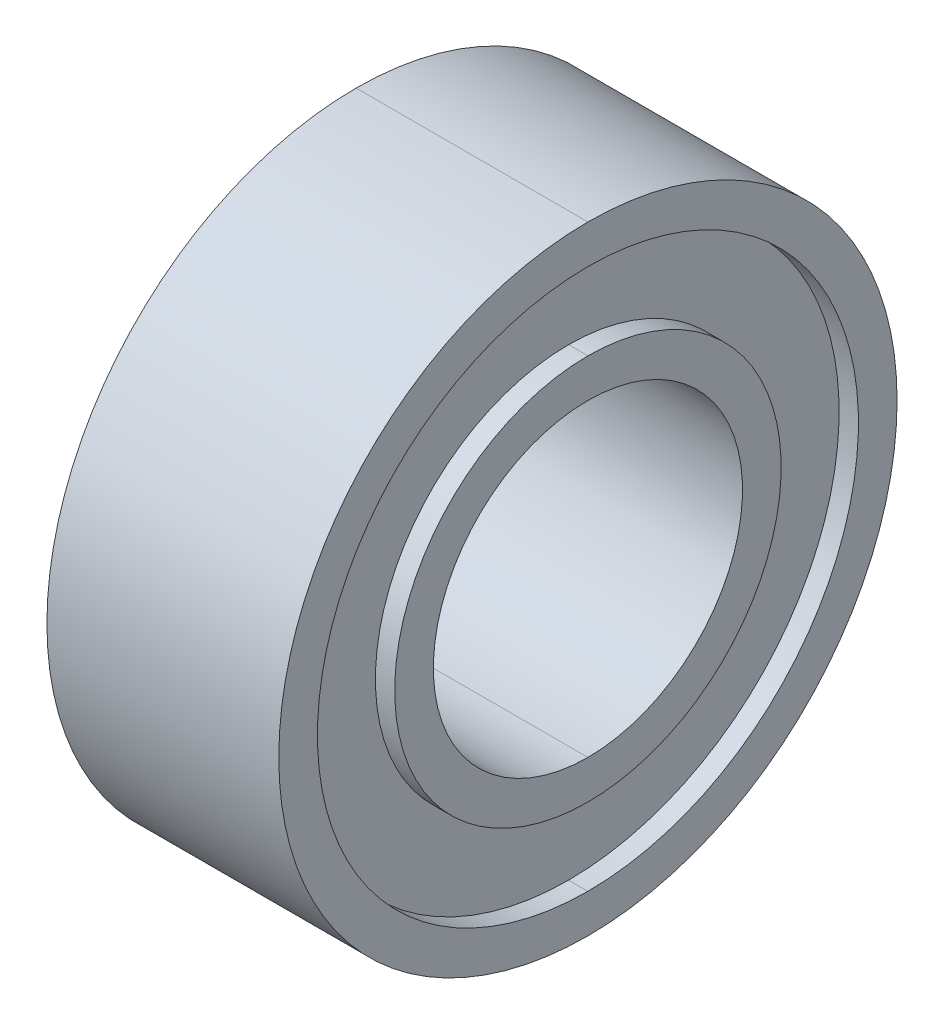
ISO-10303-21;
HEADER;
FILE_DESCRIPTION(('STEP AP214'),'2;1');
FILE_NAME('part.step','',(''),(''),'','','');
FILE_SCHEMA(('AUTOMOTIVE_DESIGN { 1 0 10303 214 1 1 1 1 }'));
ENDSEC;
DATA;
#1=APPLICATION_CONTEXT('core data for automotive mechanical design processes');
#2=APPLICATION_PROTOCOL_DEFINITION('international standard','automotive_design',2000,#1);
#3=PRODUCT_CONTEXT('',#1,'mechanical');
#4=PRODUCT('Part','Part','',(#3));
#5=PRODUCT_RELATED_PRODUCT_CATEGORY('part','',(#4));
#6=PRODUCT_DEFINITION_FORMATION('','',#4);
#7=PRODUCT_DEFINITION_CONTEXT('part definition',#1,'design');
#8=PRODUCT_DEFINITION('design','',#6,#7);
#9=PRODUCT_DEFINITION_SHAPE('','',#8);
#10=(LENGTH_UNIT() NAMED_UNIT(*) SI_UNIT(.MILLI.,.METRE.));
#11=(NAMED_UNIT(*) PLANE_ANGLE_UNIT() SI_UNIT($,.RADIAN.));
#12=(NAMED_UNIT(*) SI_UNIT($,.STERADIAN.) SOLID_ANGLE_UNIT());
#13=UNCERTAINTY_MEASURE_WITH_UNIT(LENGTH_MEASURE(1.E-05),#10,'distance_accuracy_value','');
#14=(GEOMETRIC_REPRESENTATION_CONTEXT(3) GLOBAL_UNCERTAINTY_ASSIGNED_CONTEXT((#13)) GLOBAL_UNIT_ASSIGNED_CONTEXT((#10,
#11,#12)) REPRESENTATION_CONTEXT('',''));
#15=CARTESIAN_POINT('',(0.,0.,0.));
#16=DIRECTION('',(0.,0.,1.));
#17=DIRECTION('',(1.,0.,0.));
#18=AXIS2_PLACEMENT_3D('',#15,#16,#17);
#19=CARTESIAN_POINT('',(0.,0.,0.));
#20=DIRECTION('',(1.,0.,0.));
#21=DIRECTION('',(0.,-1.,0.));
#22=AXIS2_PLACEMENT_3D('',#19,#20,#21);
#23=PLANE('',#22);
#24=CARTESIAN_POINT('',(0.,0.,0.));
#25=DIRECTION('',(-1.,0.,0.));
#26=DIRECTION('',(0.,1.,0.));
#27=AXIS2_PLACEMENT_3D('',#24,#25,#26);
#28=CIRCLE('',#27,2.);
#29=CARTESIAN_POINT('',(0.,2.,0.));
#30=VERTEX_POINT('',#29);
#31=CARTESIAN_POINT('',(0.,-2.,0.));
#32=VERTEX_POINT('',#31);
#33=EDGE_CURVE('E27',#30,#32,#28,.T.);
#34=ORIENTED_EDGE('',*,*,#33,.F.);
#35=CARTESIAN_POINT('',(0.,0.,0.));
#36=DIRECTION('',(-1.,0.,0.));
#37=DIRECTION('',(0.,-1.,0.));
#38=AXIS2_PLACEMENT_3D('',#35,#36,#37);
#39=CIRCLE('',#38,2.);
#40=EDGE_CURVE('E36',#32,#30,#39,.T.);
#41=ORIENTED_EDGE('',*,*,#40,.F.);
#42=EDGE_LOOP('',(#34,#41));
#43=FACE_BOUND('',#42,.T.);
#44=CARTESIAN_POINT('',(0.,0.,0.));
#45=DIRECTION('',(1.,0.,0.));
#46=DIRECTION('',(0.,-1.,0.));
#47=AXIS2_PLACEMENT_3D('',#44,#45,#46);
#48=CIRCLE('',#47,2.5);
#49=CARTESIAN_POINT('',(0.,-2.5,0.));
#50=VERTEX_POINT('',#49);
#51=CARTESIAN_POINT('',(0.,2.5,0.));
#52=VERTEX_POINT('',#51);
#53=EDGE_CURVE('E180',#50,#52,#48,.T.);
#54=ORIENTED_EDGE('',*,*,#53,.F.);
#55=CARTESIAN_POINT('',(0.,0.,0.));
#56=DIRECTION('',(1.,0.,0.));
#57=DIRECTION('',(0.,1.,0.));
#58=AXIS2_PLACEMENT_3D('',#55,#56,#57);
#59=CIRCLE('',#58,2.5);
#60=EDGE_CURVE('E170',#52,#50,#59,.T.);
#61=ORIENTED_EDGE('',*,*,#60,.F.);
#62=EDGE_LOOP('',(#54,#61));
#63=FACE_BOUND('',#62,.T.);
#64=ADVANCED_FACE('F16',(#43,#63),#23,.F.);
#65=CARTESIAN_POINT('',(0.,0.,0.));
#66=DIRECTION('',(-1.,0.,0.));
#67=DIRECTION('',(0.,-1.,0.));
#68=AXIS2_PLACEMENT_3D('',#65,#66,#67);
#69=CYLINDRICAL_SURFACE('',#68,2.);
#70=DIRECTION('',(1.,0.,0.));
#71=VECTOR('',#70,1.);
#72=CARTESIAN_POINT('',(0.,-2.,0.));
#73=LINE('',#72,#71);
#74=CARTESIAN_POINT('',(3.,-2.,0.));
#75=VERTEX_POINT('',#74);
#76=EDGE_CURVE('E11',#32,#75,#73,.T.);
#77=ORIENTED_EDGE('',*,*,#76,.T.);
#78=CARTESIAN_POINT('',(3.,0.,0.));
#79=DIRECTION('',(-1.,0.,0.));
#80=DIRECTION('',(0.,1.,0.));
#81=AXIS2_PLACEMENT_3D('',#78,#79,#80);
#82=CIRCLE('',#81,2.);
#83=CARTESIAN_POINT('',(3.,2.,0.));
#84=VERTEX_POINT('',#83);
#85=EDGE_CURVE('E141',#84,#75,#82,.T.);
#86=ORIENTED_EDGE('',*,*,#85,.F.);
#87=DIRECTION('',(1.,0.,0.));
#88=VECTOR('',#87,1.);
#89=CARTESIAN_POINT('',(0.,2.,0.));
#90=LINE('',#89,#88);
#91=EDGE_CURVE('E179',#30,#84,#90,.T.);
#92=ORIENTED_EDGE('',*,*,#91,.F.);
#93=ORIENTED_EDGE('',*,*,#33,.T.);
#94=EDGE_LOOP('',(#77,#86,#92,#93));
#95=FACE_BOUND('',#94,.T.);
#96=ADVANCED_FACE('F288',(#95),#69,.F.);
#97=CARTESIAN_POINT('',(0.,0.,0.));
#98=DIRECTION('',(-1.,0.,0.));
#99=DIRECTION('',(0.,-1.,0.));
#100=AXIS2_PLACEMENT_3D('',#97,#98,#99);
#101=CYLINDRICAL_SURFACE('',#100,2.);
#102=ORIENTED_EDGE('',*,*,#91,.T.);
#103=CARTESIAN_POINT('',(3.,0.,0.));
#104=DIRECTION('',(-1.,0.,0.));
#105=DIRECTION('',(0.,-1.,0.));
#106=AXIS2_PLACEMENT_3D('',#103,#104,#105);
#107=CIRCLE('',#106,2.);
#108=EDGE_CURVE('E145',#75,#84,#107,.T.);
#109=ORIENTED_EDGE('',*,*,#108,.F.);
#110=ORIENTED_EDGE('',*,*,#76,.F.);
#111=ORIENTED_EDGE('',*,*,#40,.T.);
#112=EDGE_LOOP('',(#102,#109,#110,#111));
#113=FACE_BOUND('',#112,.T.);
#114=ADVANCED_FACE('F294',(#113),#101,.F.);
#115=CARTESIAN_POINT('',(0.,0.,0.));
#116=DIRECTION('',(-1.,0.,0.));
#117=DIRECTION('',(0.,-1.,0.));
#118=AXIS2_PLACEMENT_3D('',#115,#116,#117);
#119=CYLINDRICAL_SURFACE('',#118,2.5);
#120=ORIENTED_EDGE('',*,*,#53,.T.);
#121=DIRECTION('',(1.,0.,0.));
#122=VECTOR('',#121,1.);
#123=CARTESIAN_POINT('',(0.,2.5,0.));
#124=LINE('',#123,#122);
#125=CARTESIAN_POINT('',(0.25,2.5,0.));
#126=VERTEX_POINT('',#125);
#127=EDGE_CURVE('E150',#52,#126,#124,.T.);
#128=ORIENTED_EDGE('',*,*,#127,.T.);
#129=CARTESIAN_POINT('',(0.25,0.,0.));
#130=DIRECTION('',(-1.,0.,0.));
#131=DIRECTION('',(0.,1.,0.));
#132=AXIS2_PLACEMENT_3D('',#129,#130,#131);
#133=CIRCLE('',#132,2.5);
#134=CARTESIAN_POINT('',(0.25,-2.5,0.));
#135=VERTEX_POINT('',#134);
#136=EDGE_CURVE('E146',#126,#135,#133,.T.);
#137=ORIENTED_EDGE('',*,*,#136,.T.);
#138=DIRECTION('',(1.,0.,0.));
#139=VECTOR('',#138,1.);
#140=CARTESIAN_POINT('',(0.,-2.5,0.));
#141=LINE('',#140,#139);
#142=EDGE_CURVE('E144',#50,#135,#141,.T.);
#143=ORIENTED_EDGE('',*,*,#142,.F.);
#144=EDGE_LOOP('',(#120,#128,#137,#143));
#145=FACE_BOUND('',#144,.T.);
#146=ADVANCED_FACE('F281',(#145),#119,.T.);
#147=CARTESIAN_POINT('',(0.,0.,0.));
#148=DIRECTION('',(-1.,0.,0.));
#149=DIRECTION('',(0.,-1.,0.));
#150=AXIS2_PLACEMENT_3D('',#147,#148,#149);
#151=CYLINDRICAL_SURFACE('',#150,2.5);
#152=CARTESIAN_POINT('',(0.25,0.,0.));
#153=DIRECTION('',(-1.,0.,0.));
#154=DIRECTION('',(0.,-1.,0.));
#155=AXIS2_PLACEMENT_3D('',#152,#153,#154);
#156=CIRCLE('',#155,2.5);
#157=EDGE_CURVE('E151',#135,#126,#156,.T.);
#158=ORIENTED_EDGE('',*,*,#157,.T.);
#159=ORIENTED_EDGE('',*,*,#127,.F.);
#160=ORIENTED_EDGE('',*,*,#60,.T.);
#161=ORIENTED_EDGE('',*,*,#142,.T.);
#162=EDGE_LOOP('',(#158,#159,#160,#161));
#163=FACE_BOUND('',#162,.T.);
#164=ADVANCED_FACE('F275',(#163),#151,.T.);
#165=CARTESIAN_POINT('',(3.,0.,0.));
#166=DIRECTION('',(1.,0.,0.));
#167=DIRECTION('',(0.,-1.,0.));
#168=AXIS2_PLACEMENT_3D('',#165,#166,#167);
#169=PLANE('',#168);
#170=ORIENTED_EDGE('',*,*,#85,.T.);
#171=ORIENTED_EDGE('',*,*,#108,.T.);
#172=EDGE_LOOP('',(#170,#171));
#173=FACE_BOUND('',#172,.T.);
#174=CARTESIAN_POINT('',(3.,0.,0.));
#175=DIRECTION('',(1.,0.,0.));
#176=DIRECTION('',(0.,-1.,0.));
#177=AXIS2_PLACEMENT_3D('',#174,#175,#176);
#178=CIRCLE('',#177,2.5);
#179=CARTESIAN_POINT('',(3.,-2.5,0.));
#180=VERTEX_POINT('',#179);
#181=CARTESIAN_POINT('',(3.,2.5,0.));
#182=VERTEX_POINT('',#181);
#183=EDGE_CURVE('E160',#180,#182,#178,.T.);
#184=ORIENTED_EDGE('',*,*,#183,.T.);
#185=CARTESIAN_POINT('',(3.,0.,0.));
#186=DIRECTION('',(1.,0.,0.));
#187=DIRECTION('',(0.,1.,0.));
#188=AXIS2_PLACEMENT_3D('',#185,#186,#187);
#189=CIRCLE('',#188,2.5);
#190=EDGE_CURVE('E175',#182,#180,#189,.T.);
#191=ORIENTED_EDGE('',*,*,#190,.T.);
#192=EDGE_LOOP('',(#184,#191));
#193=FACE_BOUND('',#192,.T.);
#194=ADVANCED_FACE('F280',(#173,#193),#169,.T.);
#195=CARTESIAN_POINT('',(0.25,0.,0.));
#196=DIRECTION('',(1.,0.,0.));
#197=DIRECTION('',(0.,-1.,0.));
#198=AXIS2_PLACEMENT_3D('',#195,#196,#197);
#199=PLANE('',#198);
#200=CARTESIAN_POINT('',(0.25,0.,0.));
#201=DIRECTION('',(1.,0.,0.));
#202=DIRECTION('',(0.,1.,0.));
#203=AXIS2_PLACEMENT_3D('',#200,#201,#202);
#204=CIRCLE('',#203,3.5);
#205=CARTESIAN_POINT('',(0.25,3.5,0.));
#206=VERTEX_POINT('',#205);
#207=CARTESIAN_POINT('',(0.25,-3.5,0.));
#208=VERTEX_POINT('',#207);
#209=EDGE_CURVE('E107',#206,#208,#204,.T.);
#210=ORIENTED_EDGE('',*,*,#209,.F.);
#211=CARTESIAN_POINT('',(0.25,0.,0.));
#212=DIRECTION('',(1.,0.,0.));
#213=DIRECTION('',(0.,-1.,0.));
#214=AXIS2_PLACEMENT_3D('',#211,#212,#213);
#215=CIRCLE('',#214,3.5);
#216=EDGE_CURVE('E103',#208,#206,#215,.T.);
#217=ORIENTED_EDGE('',*,*,#216,.F.);
#218=EDGE_LOOP('',(#210,#217));
#219=FACE_BOUND('',#218,.T.);
#220=ORIENTED_EDGE('',*,*,#136,.F.);
#221=ORIENTED_EDGE('',*,*,#157,.F.);
#222=EDGE_LOOP('',(#220,#221));
#223=FACE_BOUND('',#222,.T.);
#224=ADVANCED_FACE('F105',(#219,#223),#199,.F.);
#225=CARTESIAN_POINT('',(3.,0.,0.));
#226=DIRECTION('',(-1.,0.,0.));
#227=DIRECTION('',(0.,-1.,0.));
#228=AXIS2_PLACEMENT_3D('',#225,#226,#227);
#229=CYLINDRICAL_SURFACE('',#228,2.5);
#230=DIRECTION('',(-1.,0.,0.));
#231=VECTOR('',#230,1.);
#232=CARTESIAN_POINT('',(3.,-2.5,0.));
#233=LINE('',#232,#231);
#234=CARTESIAN_POINT('',(2.75,-2.5,0.));
#235=VERTEX_POINT('',#234);
#236=EDGE_CURVE('E210',#180,#235,#233,.T.);
#237=ORIENTED_EDGE('',*,*,#236,.T.);
#238=CARTESIAN_POINT('',(2.75,0.,0.));
#239=DIRECTION('',(-1.,0.,0.));
#240=DIRECTION('',(0.,1.,0.));
#241=AXIS2_PLACEMENT_3D('',#238,#239,#240);
#242=CIRCLE('',#241,2.5);
#243=CARTESIAN_POINT('',(2.75,2.5,0.));
#244=VERTEX_POINT('',#243);
#245=EDGE_CURVE('E140',#244,#235,#242,.T.);
#246=ORIENTED_EDGE('',*,*,#245,.F.);
#247=DIRECTION('',(-1.,0.,0.));
#248=VECTOR('',#247,1.);
#249=CARTESIAN_POINT('',(3.,2.5,0.));
#250=LINE('',#249,#248);
#251=EDGE_CURVE('E206',#182,#244,#250,.T.);
#252=ORIENTED_EDGE('',*,*,#251,.F.);
#253=ORIENTED_EDGE('',*,*,#183,.F.);
#254=EDGE_LOOP('',(#237,#246,#252,#253));
#255=FACE_BOUND('',#254,.T.);
#256=ADVANCED_FACE('F225',(#255),#229,.T.);
#257=CARTESIAN_POINT('',(3.,0.,0.));
#258=DIRECTION('',(-1.,0.,0.));
#259=DIRECTION('',(0.,-1.,0.));
#260=AXIS2_PLACEMENT_3D('',#257,#258,#259);
#261=CYLINDRICAL_SURFACE('',#260,2.5);
#262=ORIENTED_EDGE('',*,*,#251,.T.);
#263=CARTESIAN_POINT('',(2.75,0.,0.));
#264=DIRECTION('',(-1.,0.,0.));
#265=DIRECTION('',(0.,-1.,0.));
#266=AXIS2_PLACEMENT_3D('',#263,#264,#265);
#267=CIRCLE('',#266,2.5);
#268=EDGE_CURVE('E168',#235,#244,#267,.T.);
#269=ORIENTED_EDGE('',*,*,#268,.F.);
#270=ORIENTED_EDGE('',*,*,#236,.F.);
#271=ORIENTED_EDGE('',*,*,#190,.F.);
#272=EDGE_LOOP('',(#262,#269,#270,#271));
#273=FACE_BOUND('',#272,.T.);
#274=ADVANCED_FACE('F229',(#273),#261,.T.);
#275=CARTESIAN_POINT('',(0.,0.,0.));
#276=DIRECTION('',(-1.,0.,0.));
#277=DIRECTION('',(0.,-1.,0.));
#278=AXIS2_PLACEMENT_3D('',#275,#276,#277);
#279=CYLINDRICAL_SURFACE('',#278,3.5);
#280=CARTESIAN_POINT('',(0.,0.,0.));
#281=DIRECTION('',(1.,0.,0.));
#282=DIRECTION('',(0.,1.,0.));
#283=AXIS2_PLACEMENT_3D('',#280,#281,#282);
#284=CIRCLE('',#283,3.5);
#285=CARTESIAN_POINT('',(0.,3.5,0.));
#286=VERTEX_POINT('',#285);
#287=CARTESIAN_POINT('',(0.,-3.5,0.));
#288=VERTEX_POINT('',#287);
#289=EDGE_CURVE('E197',#286,#288,#284,.T.);
#290=ORIENTED_EDGE('',*,*,#289,.F.);
#291=DIRECTION('',(1.,0.,0.));
#292=VECTOR('',#291,1.);
#293=CARTESIAN_POINT('',(0.,3.5,0.));
#294=LINE('',#293,#292);
#295=EDGE_CURVE('E119',#286,#206,#294,.T.);
#296=ORIENTED_EDGE('',*,*,#295,.T.);
#297=ORIENTED_EDGE('',*,*,#209,.T.);
#298=DIRECTION('',(1.,0.,0.));
#299=VECTOR('',#298,1.);
#300=CARTESIAN_POINT('',(0.,-3.5,0.));
#301=LINE('',#300,#299);
#302=EDGE_CURVE('E113',#288,#208,#301,.T.);
#303=ORIENTED_EDGE('',*,*,#302,.F.);
#304=EDGE_LOOP('',(#290,#296,#297,#303));
#305=FACE_BOUND('',#304,.T.);
#306=ADVANCED_FACE('F117',(#305),#279,.F.);
#307=CARTESIAN_POINT('',(0.,0.,0.));
#308=DIRECTION('',(-1.,0.,0.));
#309=DIRECTION('',(0.,-1.,0.));
#310=AXIS2_PLACEMENT_3D('',#307,#308,#309);
#311=CYLINDRICAL_SURFACE('',#310,3.5);
#312=ORIENTED_EDGE('',*,*,#216,.T.);
#313=ORIENTED_EDGE('',*,*,#295,.F.);
#314=CARTESIAN_POINT('',(0.,0.,0.));
#315=DIRECTION('',(1.,0.,0.));
#316=DIRECTION('',(0.,-1.,0.));
#317=AXIS2_PLACEMENT_3D('',#314,#315,#316);
#318=CIRCLE('',#317,3.5);
#319=EDGE_CURVE('E124',#288,#286,#318,.T.);
#320=ORIENTED_EDGE('',*,*,#319,.F.);
#321=ORIENTED_EDGE('',*,*,#302,.T.);
#322=EDGE_LOOP('',(#312,#313,#320,#321));
#323=FACE_BOUND('',#322,.T.);
#324=ADVANCED_FACE('F122',(#323),#311,.F.);
#325=CARTESIAN_POINT('',(2.75,0.,0.));
#326=DIRECTION('',(1.,0.,0.));
#327=DIRECTION('',(0.,-1.,0.));
#328=AXIS2_PLACEMENT_3D('',#325,#326,#327);
#329=PLANE('',#328);
#330=CARTESIAN_POINT('',(2.75,0.,0.));
#331=DIRECTION('',(1.,0.,0.));
#332=DIRECTION('',(0.,1.,0.));
#333=AXIS2_PLACEMENT_3D('',#330,#331,#332);
#334=CIRCLE('',#333,3.5);
#335=CARTESIAN_POINT('',(2.75,3.5,0.));
#336=VERTEX_POINT('',#335);
#337=CARTESIAN_POINT('',(2.75,-3.5,0.));
#338=VERTEX_POINT('',#337);
#339=EDGE_CURVE('E126',#336,#338,#334,.T.);
#340=ORIENTED_EDGE('',*,*,#339,.T.);
#341=CARTESIAN_POINT('',(2.75,0.,0.));
#342=DIRECTION('',(1.,0.,0.));
#343=DIRECTION('',(0.,-1.,0.));
#344=AXIS2_PLACEMENT_3D('',#341,#342,#343);
#345=CIRCLE('',#344,3.5);
#346=EDGE_CURVE('E134',#338,#336,#345,.T.);
#347=ORIENTED_EDGE('',*,*,#346,.T.);
#348=EDGE_LOOP('',(#340,#347));
#349=FACE_BOUND('',#348,.T.);
#350=ORIENTED_EDGE('',*,*,#245,.T.);
#351=ORIENTED_EDGE('',*,*,#268,.T.);
#352=EDGE_LOOP('',(#350,#351));
#353=FACE_BOUND('',#352,.T.);
#354=ADVANCED_FACE('F365',(#349,#353),#329,.T.);
#355=CARTESIAN_POINT('',(0.,0.,0.));
#356=DIRECTION('',(1.,0.,0.));
#357=DIRECTION('',(0.,-1.,0.));
#358=AXIS2_PLACEMENT_3D('',#355,#356,#357);
#359=PLANE('',#358);
#360=ORIENTED_EDGE('',*,*,#289,.T.);
#361=ORIENTED_EDGE('',*,*,#319,.T.);
#362=EDGE_LOOP('',(#360,#361));
#363=FACE_BOUND('',#362,.T.);
#364=CARTESIAN_POINT('',(0.,0.,0.));
#365=DIRECTION('',(1.,0.,0.));
#366=DIRECTION('',(0.,1.,0.));
#367=AXIS2_PLACEMENT_3D('',#364,#365,#366);
#368=CIRCLE('',#367,4.);
#369=CARTESIAN_POINT('',(0.,4.,0.));
#370=VERTEX_POINT('',#369);
#371=CARTESIAN_POINT('',(0.,-4.,0.));
#372=VERTEX_POINT('',#371);
#373=EDGE_CURVE('E184',#370,#372,#368,.T.);
#374=ORIENTED_EDGE('',*,*,#373,.F.);
#375=CARTESIAN_POINT('',(0.,0.,0.));
#376=DIRECTION('',(1.,0.,0.));
#377=DIRECTION('',(0.,-1.,0.));
#378=AXIS2_PLACEMENT_3D('',#375,#376,#377);
#379=CIRCLE('',#378,4.);
#380=EDGE_CURVE('E152',#372,#370,#379,.T.);
#381=ORIENTED_EDGE('',*,*,#380,.F.);
#382=EDGE_LOOP('',(#374,#381));
#383=FACE_BOUND('',#382,.T.);
#384=ADVANCED_FACE('F268',(#363,#383),#359,.F.);
#385=CARTESIAN_POINT('',(3.,0.,0.));
#386=DIRECTION('',(-1.,0.,0.));
#387=DIRECTION('',(0.,-1.,0.));
#388=AXIS2_PLACEMENT_3D('',#385,#386,#387);
#389=CYLINDRICAL_SURFACE('',#388,3.5);
#390=DIRECTION('',(-1.,0.,0.));
#391=VECTOR('',#390,1.);
#392=CARTESIAN_POINT('',(3.,-3.5,0.));
#393=LINE('',#392,#391);
#394=CARTESIAN_POINT('',(3.,-3.5,0.));
#395=VERTEX_POINT('',#394);
#396=EDGE_CURVE('E198',#395,#338,#393,.T.);
#397=ORIENTED_EDGE('',*,*,#396,.T.);
#398=ORIENTED_EDGE('',*,*,#339,.F.);
#399=DIRECTION('',(-1.,0.,0.));
#400=VECTOR('',#399,1.);
#401=CARTESIAN_POINT('',(3.,3.5,0.));
#402=LINE('',#401,#400);
#403=CARTESIAN_POINT('',(3.,3.5,0.));
#404=VERTEX_POINT('',#403);
#405=EDGE_CURVE('E161',#404,#336,#402,.T.);
#406=ORIENTED_EDGE('',*,*,#405,.F.);
#407=CARTESIAN_POINT('',(3.,0.,0.));
#408=DIRECTION('',(1.,0.,0.));
#409=DIRECTION('',(0.,1.,0.));
#410=AXIS2_PLACEMENT_3D('',#407,#408,#409);
#411=CIRCLE('',#410,3.5);
#412=EDGE_CURVE('E164',#404,#395,#411,.T.);
#413=ORIENTED_EDGE('',*,*,#412,.T.);
#414=EDGE_LOOP('',(#397,#398,#406,#413));
#415=FACE_BOUND('',#414,.T.);
#416=ADVANCED_FACE('F251',(#415),#389,.F.);
#417=CARTESIAN_POINT('',(3.,0.,0.));
#418=DIRECTION('',(-1.,0.,0.));
#419=DIRECTION('',(0.,-1.,0.));
#420=AXIS2_PLACEMENT_3D('',#417,#418,#419);
#421=CYLINDRICAL_SURFACE('',#420,3.5);
#422=ORIENTED_EDGE('',*,*,#405,.T.);
#423=ORIENTED_EDGE('',*,*,#346,.F.);
#424=ORIENTED_EDGE('',*,*,#396,.F.);
#425=CARTESIAN_POINT('',(3.,0.,0.));
#426=DIRECTION('',(1.,0.,0.));
#427=DIRECTION('',(0.,-1.,0.));
#428=AXIS2_PLACEMENT_3D('',#425,#426,#427);
#429=CIRCLE('',#428,3.5);
#430=EDGE_CURVE('E20',#395,#404,#429,.T.);
#431=ORIENTED_EDGE('',*,*,#430,.T.);
#432=EDGE_LOOP('',(#422,#423,#424,#431));
#433=FACE_BOUND('',#432,.T.);
#434=ADVANCED_FACE('F256',(#433),#421,.F.);
#435=CARTESIAN_POINT('',(0.,0.,0.));
#436=DIRECTION('',(-1.,0.,0.));
#437=DIRECTION('',(0.,-1.,0.));
#438=AXIS2_PLACEMENT_3D('',#435,#436,#437);
#439=CYLINDRICAL_SURFACE('',#438,4.);
#440=DIRECTION('',(1.,0.,0.));
#441=VECTOR('',#440,1.);
#442=CARTESIAN_POINT('',(0.,-4.,0.));
#443=LINE('',#442,#441);
#444=CARTESIAN_POINT('',(3.,-4.,0.));
#445=VERTEX_POINT('',#444);
#446=EDGE_CURVE('E188',#372,#445,#443,.T.);
#447=ORIENTED_EDGE('',*,*,#446,.T.);
#448=CARTESIAN_POINT('',(3.,0.,0.));
#449=DIRECTION('',(1.,0.,0.));
#450=DIRECTION('',(0.,1.,0.));
#451=AXIS2_PLACEMENT_3D('',#448,#449,#450);
#452=CIRCLE('',#451,4.);
#453=CARTESIAN_POINT('',(3.,4.,0.));
#454=VERTEX_POINT('',#453);
#455=EDGE_CURVE('E156',#454,#445,#452,.T.);
#456=ORIENTED_EDGE('',*,*,#455,.F.);
#457=DIRECTION('',(1.,0.,0.));
#458=VECTOR('',#457,1.);
#459=CARTESIAN_POINT('',(0.,4.,0.));
#460=LINE('',#459,#458);
#461=EDGE_CURVE('E155',#370,#454,#460,.T.);
#462=ORIENTED_EDGE('',*,*,#461,.F.);
#463=ORIENTED_EDGE('',*,*,#373,.T.);
#464=EDGE_LOOP('',(#447,#456,#462,#463));
#465=FACE_BOUND('',#464,.T.);
#466=ADVANCED_FACE('F18',(#465),#439,.T.);
#467=CARTESIAN_POINT('',(0.,0.,0.));
#468=DIRECTION('',(-1.,0.,0.));
#469=DIRECTION('',(0.,-1.,0.));
#470=AXIS2_PLACEMENT_3D('',#467,#468,#469);
#471=CYLINDRICAL_SURFACE('',#470,4.);
#472=ORIENTED_EDGE('',*,*,#461,.T.);
#473=CARTESIAN_POINT('',(3.,0.,0.));
#474=DIRECTION('',(1.,0.,0.));
#475=DIRECTION('',(0.,-1.,0.));
#476=AXIS2_PLACEMENT_3D('',#473,#474,#475);
#477=CIRCLE('',#476,4.);
#478=EDGE_CURVE('E192',#445,#454,#477,.T.);
#479=ORIENTED_EDGE('',*,*,#478,.F.);
#480=ORIENTED_EDGE('',*,*,#446,.F.);
#481=ORIENTED_EDGE('',*,*,#380,.T.);
#482=EDGE_LOOP('',(#472,#479,#480,#481));
#483=FACE_BOUND('',#482,.T.);
#484=ADVANCED_FACE('F380',(#483),#471,.T.);
#485=CARTESIAN_POINT('',(3.,0.,0.));
#486=DIRECTION('',(1.,0.,0.));
#487=DIRECTION('',(0.,-1.,0.));
#488=AXIS2_PLACEMENT_3D('',#485,#486,#487);
#489=PLANE('',#488);
#490=ORIENTED_EDGE('',*,*,#412,.F.);
#491=ORIENTED_EDGE('',*,*,#430,.F.);
#492=EDGE_LOOP('',(#490,#491));
#493=FACE_BOUND('',#492,.T.);
#494=ORIENTED_EDGE('',*,*,#455,.T.);
#495=ORIENTED_EDGE('',*,*,#478,.T.);
#496=EDGE_LOOP('',(#494,#495));
#497=FACE_BOUND('',#496,.T.);
#498=ADVANCED_FACE('F258',(#493,#497),#489,.T.);
#499=CLOSED_SHELL('',(#64,#96,#114,#146,#164,#194,#224,#256,#274,#306,#324,#354,#384,#416,#434,
#466,#484,#498));
#500=MANIFOLD_SOLID_BREP('B1',#499);
#501=ADVANCED_BREP_SHAPE_REPRESENTATION('',(#18,#500),#14);
#502=SHAPE_DEFINITION_REPRESENTATION(#9,#501);
ENDSEC;
END-ISO-10303-21;
